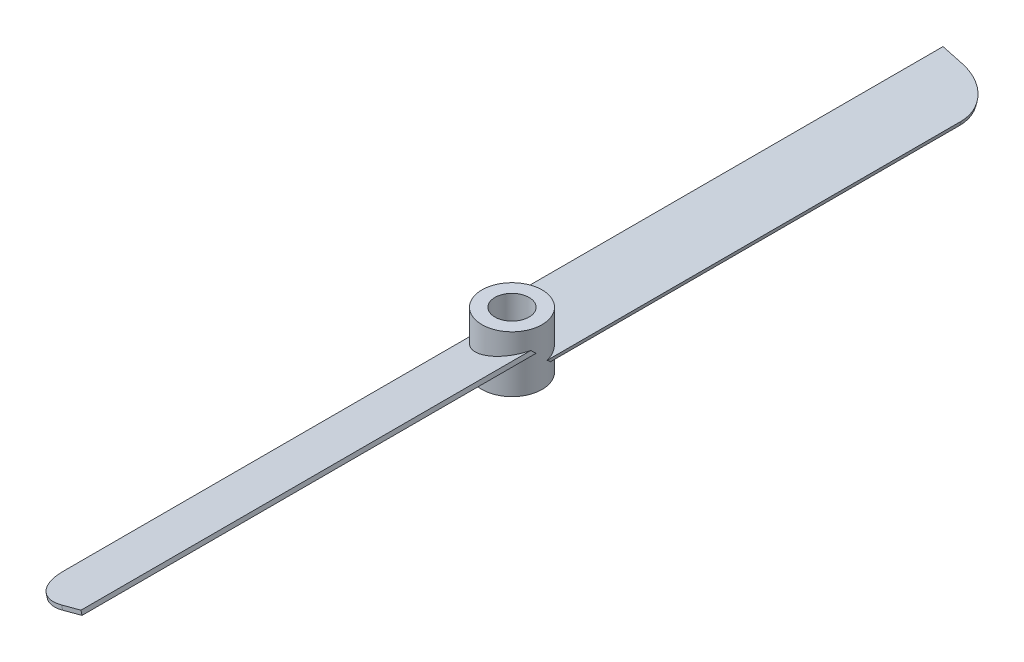
ISO-10303-21;
HEADER;
FILE_DESCRIPTION(('STEP AP214'),'2;1');
FILE_NAME('part.step','',(''),(''),'','','');
FILE_SCHEMA(('AUTOMOTIVE_DESIGN { 1 0 10303 214 1 1 1 1 }'));
ENDSEC;
DATA;
#1=APPLICATION_CONTEXT('core data for automotive mechanical design processes');
#2=APPLICATION_PROTOCOL_DEFINITION('international standard','automotive_design',2000,#1);
#3=PRODUCT_CONTEXT('',#1,'mechanical');
#4=PRODUCT('Part','Part','',(#3));
#5=PRODUCT_RELATED_PRODUCT_CATEGORY('part','',(#4));
#6=PRODUCT_DEFINITION_FORMATION('','',#4);
#7=PRODUCT_DEFINITION_CONTEXT('part definition',#1,'design');
#8=PRODUCT_DEFINITION('design','',#6,#7);
#9=PRODUCT_DEFINITION_SHAPE('','',#8);
#10=(LENGTH_UNIT() NAMED_UNIT(*) SI_UNIT(.MILLI.,.METRE.));
#11=(NAMED_UNIT(*) PLANE_ANGLE_UNIT() SI_UNIT($,.RADIAN.));
#12=(NAMED_UNIT(*) SI_UNIT($,.STERADIAN.) SOLID_ANGLE_UNIT());
#13=UNCERTAINTY_MEASURE_WITH_UNIT(LENGTH_MEASURE(1.E-05),#10,'distance_accuracy_value','');
#14=(GEOMETRIC_REPRESENTATION_CONTEXT(3) GLOBAL_UNCERTAINTY_ASSIGNED_CONTEXT((#13)) GLOBAL_UNIT_ASSIGNED_CONTEXT((#10,
#11,#12)) REPRESENTATION_CONTEXT('',''));
#15=CARTESIAN_POINT('',(0.,0.,0.));
#16=DIRECTION('',(0.,0.,1.));
#17=DIRECTION('',(1.,0.,0.));
#18=AXIS2_PLACEMENT_3D('',#15,#16,#17);
#19=CARTESIAN_POINT('',(0.,14.,0.));
#20=DIRECTION('',(0.,-1.,0.));
#21=DIRECTION('',(0.,0.,-1.));
#22=AXIS2_PLACEMENT_3D('',#19,#20,#21);
#23=CYLINDRICAL_SURFACE('',#22,7.5);
#24=CARTESIAN_POINT('',(0.,-21.9777747886716,0.));
#25=DIRECTION('',(-0.965925826289067,0.258819045102524,0.));
#26=DIRECTION('',(-0.258819045102524,-0.965925826289067,0.));
#27=AXIS2_PLACEMENT_3D('',#24,#25,#26);
#28=ELLIPSE('',#27,28.9777747886716,7.5);
#29=CARTESIAN_POINT('',(7.11046910095244,4.55885716173106,-2.38562972072383));
#30=VERTEX_POINT('',#29);
#31=CARTESIAN_POINT('',(7.37841829338357,5.55885716173106,-1.34496969774887));
#32=VERTEX_POINT('',#31);
#33=EDGE_CURVE('E124',#30,#32,#28,.F.);
#34=ORIENTED_EDGE('',*,*,#33,.T.);
#35=CARTESIAN_POINT('',(0.,7.53589838486225,0.));
#36=DIRECTION('',(0.258819045102525,0.965925826289067,0.));
#37=DIRECTION('',(0.965925826289067,-0.258819045102525,0.));
#38=AXIS2_PLACEMENT_3D('',#35,#36,#37);
#39=ELLIPSE('',#38,7.76457135307563,7.5);
#40=CARTESIAN_POINT('',(-7.11046910095244,9.44114283826893,-2.38562972072377));
#41=VERTEX_POINT('',#40);
#42=EDGE_CURVE('E116',#32,#41,#39,.T.);
#43=ORIENTED_EDGE('',*,*,#42,.T.);
#44=CARTESIAN_POINT('',(0.,35.9777747886716,0.));
#45=DIRECTION('',(-0.965925826289067,0.258819045102525,0.));
#46=DIRECTION('',(-0.258819045102525,-0.965925826289067,0.));
#47=AXIS2_PLACEMENT_3D('',#44,#45,#46);
#48=ELLIPSE('',#47,28.9777747886716,7.5);
#49=CARTESIAN_POINT('',(-7.37841829338358,8.44114283826894,-1.34496969774883));
#50=VERTEX_POINT('',#49);
#51=EDGE_CURVE('E121',#50,#41,#48,.F.);
#52=ORIENTED_EDGE('',*,*,#51,.F.);
#53=CARTESIAN_POINT('',(0.,6.46410161513775,0.));
#54=DIRECTION('',(0.258819045102525,0.965925826289067,0.));
#55=DIRECTION('',(0.965925826289067,-0.258819045102525,0.));
#56=AXIS2_PLACEMENT_3D('',#53,#54,#55);
#57=ELLIPSE('',#56,7.76457135307563,7.5);
#58=EDGE_CURVE('E127',#30,#50,#57,.T.);
#59=ORIENTED_EDGE('',*,*,#58,.F.);
#60=EDGE_LOOP('',(#34,#43,#52,#59));
#61=FACE_BOUND('',#60,.T.);
#62=CARTESIAN_POINT('',(0.,14.,0.));
#63=DIRECTION('',(0.,1.,0.));
#64=DIRECTION('',(0.,0.,1.));
#65=AXIS2_PLACEMENT_3D('',#62,#63,#64);
#66=CIRCLE('',#65,7.5);
#67=CARTESIAN_POINT('',(0.,14.,7.5));
#68=VERTEX_POINT('',#67);
#69=EDGE_CURVE('E203',#68,#68,#66,.T.);
#70=ORIENTED_EDGE('',*,*,#69,.F.);
#71=EDGE_LOOP('',(#70));
#72=FACE_BOUND('',#71,.T.);
#73=CARTESIAN_POINT('',(0.,0.,0.));
#74=DIRECTION('',(0.,1.,0.));
#75=DIRECTION('',(0.,0.,1.));
#76=AXIS2_PLACEMENT_3D('',#73,#74,#75);
#77=CIRCLE('',#76,7.5);
#78=CARTESIAN_POINT('',(0.,0.,7.5));
#79=VERTEX_POINT('',#78);
#80=EDGE_CURVE('E202',#79,#79,#77,.T.);
#81=ORIENTED_EDGE('',*,*,#80,.T.);
#82=EDGE_LOOP('',(#81));
#83=FACE_BOUND('',#82,.T.);
#84=CARTESIAN_POINT('',(0.,-21.9777747886716,0.));
#85=DIRECTION('',(0.965925826289067,0.258819045102524,0.));
#86=DIRECTION('',(0.258819045102525,-0.965925826289067,0.));
#87=AXIS2_PLACEMENT_3D('',#84,#85,#86);
#88=ELLIPSE('',#87,28.9777747886716,7.5);
#89=CARTESIAN_POINT('',(-7.11046910095244,4.55885716173106,2.38562972072383));
#90=VERTEX_POINT('',#89);
#91=CARTESIAN_POINT('',(-7.37841829338357,5.55885716173106,1.34496969774887));
#92=VERTEX_POINT('',#91);
#93=EDGE_CURVE('E166',#90,#92,#88,.F.);
#94=ORIENTED_EDGE('',*,*,#93,.T.);
#95=CARTESIAN_POINT('',(0.,7.53589838486225,0.));
#96=DIRECTION('',(-0.258819045102525,0.965925826289067,0.));
#97=DIRECTION('',(-0.965925826289067,-0.258819045102525,0.));
#98=AXIS2_PLACEMENT_3D('',#95,#96,#97);
#99=ELLIPSE('',#98,7.76457135307563,7.5);
#100=CARTESIAN_POINT('',(7.11046910095244,9.44114283826893,2.38562972072377));
#101=VERTEX_POINT('',#100);
#102=EDGE_CURVE('E213',#92,#101,#99,.T.);
#103=ORIENTED_EDGE('',*,*,#102,.T.);
#104=CARTESIAN_POINT('',(0.,35.9777747886716,0.));
#105=DIRECTION('',(0.965925826289067,0.258819045102525,0.));
#106=DIRECTION('',(0.258819045102525,-0.965925826289067,0.));
#107=AXIS2_PLACEMENT_3D('',#104,#105,#106);
#108=ELLIPSE('',#107,28.9777747886716,7.5);
#109=CARTESIAN_POINT('',(7.37841829338357,8.44114283826893,1.34496969774889));
#110=VERTEX_POINT('',#109);
#111=EDGE_CURVE('E157',#110,#101,#108,.F.);
#112=ORIENTED_EDGE('',*,*,#111,.F.);
#113=CARTESIAN_POINT('',(0.,6.46410161513775,0.));
#114=DIRECTION('',(-0.258819045102525,0.965925826289067,0.));
#115=DIRECTION('',(-0.965925826289067,-0.258819045102525,0.));
#116=AXIS2_PLACEMENT_3D('',#113,#114,#115);
#117=ELLIPSE('',#116,7.76457135307563,7.5);
#118=EDGE_CURVE('E207',#90,#110,#117,.T.);
#119=ORIENTED_EDGE('',*,*,#118,.F.);
#120=EDGE_LOOP('',(#94,#103,#112,#119));
#121=FACE_BOUND('',#120,.T.);
#122=ADVANCED_FACE('F39',(#61,#72,#83,#121),#23,.T.);
#123=CARTESIAN_POINT('',(0.,14.,0.));
#124=DIRECTION('',(0.,1.,0.));
#125=DIRECTION('',(0.,0.,1.));
#126=AXIS2_PLACEMENT_3D('',#123,#124,#125);
#127=PLANE('',#126);
#128=CARTESIAN_POINT('',(0.,14.,0.));
#129=DIRECTION('',(0.,1.,0.));
#130=DIRECTION('',(0.,0.,1.));
#131=AXIS2_PLACEMENT_3D('',#128,#129,#130);
#132=CIRCLE('',#131,4.25);
#133=CARTESIAN_POINT('',(0.,14.,4.25));
#134=VERTEX_POINT('',#133);
#135=EDGE_CURVE('E184',#134,#134,#132,.T.);
#136=ORIENTED_EDGE('',*,*,#135,.F.);
#137=EDGE_LOOP('',(#136));
#138=FACE_BOUND('',#137,.T.);
#139=ORIENTED_EDGE('',*,*,#69,.T.);
#140=EDGE_LOOP('',(#139));
#141=FACE_BOUND('',#140,.T.);
#142=ADVANCED_FACE('F254',(#138,#141),#127,.T.);
#143=CARTESIAN_POINT('',(0.,0.,0.));
#144=DIRECTION('',(0.,1.,0.));
#145=DIRECTION('',(0.,0.,1.));
#146=AXIS2_PLACEMENT_3D('',#143,#144,#145);
#147=PLANE('',#146);
#148=CARTESIAN_POINT('',(0.,0.,0.));
#149=DIRECTION('',(0.,1.,0.));
#150=DIRECTION('',(0.,0.,1.));
#151=AXIS2_PLACEMENT_3D('',#148,#149,#150);
#152=CIRCLE('',#151,4.25);
#153=CARTESIAN_POINT('',(0.,0.,4.25));
#154=VERTEX_POINT('',#153);
#155=EDGE_CURVE('E198',#154,#154,#152,.F.);
#156=ORIENTED_EDGE('',*,*,#155,.F.);
#157=EDGE_LOOP('',(#156));
#158=FACE_BOUND('',#157,.T.);
#159=ORIENTED_EDGE('',*,*,#80,.F.);
#160=EDGE_LOOP('',(#159));
#161=FACE_BOUND('',#160,.T.);
#162=ADVANCED_FACE('F259',(#158,#161),#147,.F.);
#163=CARTESIAN_POINT('',(0.,-0.000999999999999265,0.));
#164=DIRECTION('',(0.,1.,0.));
#165=DIRECTION('',(0.,0.,1.));
#166=AXIS2_PLACEMENT_3D('',#163,#164,#165);
#167=CYLINDRICAL_SURFACE('',#166,4.25);
#168=CARTESIAN_POINT('',(0.,14.,4.25));
#169=CARTESIAN_POINT('',(0.,13.8541666666667,4.25));
#170=CARTESIAN_POINT('',(0.,13.7083333333333,4.25));
#171=CARTESIAN_POINT('',(0.,13.4166666666667,4.25));
#172=CARTESIAN_POINT('',(0.,13.2708333333333,4.25));
#173=CARTESIAN_POINT('',(0.,12.9791666666667,4.25));
#174=CARTESIAN_POINT('',(0.,12.8333333333333,4.25));
#175=CARTESIAN_POINT('',(0.,12.5416666666667,4.25));
#176=CARTESIAN_POINT('',(0.,12.3958333333333,4.25));
#177=CARTESIAN_POINT('',(0.,12.1041666666667,4.25));
#178=CARTESIAN_POINT('',(0.,11.9583333333333,4.25));
#179=CARTESIAN_POINT('',(0.,11.6666666666667,4.25));
#180=CARTESIAN_POINT('',(0.,11.5208333333333,4.25));
#181=CARTESIAN_POINT('',(0.,11.2291666666667,4.25));
#182=CARTESIAN_POINT('',(0.,11.0833333333333,4.25));
#183=CARTESIAN_POINT('',(0.,10.7916666666667,4.25));
#184=CARTESIAN_POINT('',(0.,10.6458333333333,4.25));
#185=CARTESIAN_POINT('',(0.,10.3541666666667,4.25));
#186=CARTESIAN_POINT('',(0.,10.2083333333333,4.25));
#187=CARTESIAN_POINT('',(0.,9.91666666666667,4.25));
#188=CARTESIAN_POINT('',(0.,9.77083333333333,4.25));
#189=CARTESIAN_POINT('',(0.,9.47916666666667,4.25));
#190=CARTESIAN_POINT('',(0.,9.33333333333333,4.25));
#191=CARTESIAN_POINT('',(0.,9.04166666666666,4.25));
#192=CARTESIAN_POINT('',(0.,8.89583333333333,4.25));
#193=CARTESIAN_POINT('',(0.,8.60416666666666,4.25));
#194=CARTESIAN_POINT('',(0.,8.45833333333333,4.25));
#195=CARTESIAN_POINT('',(0.,8.16666666666667,4.25));
#196=CARTESIAN_POINT('',(0.,8.02083333333333,4.25));
#197=CARTESIAN_POINT('',(0.,7.72916666666667,4.25));
#198=CARTESIAN_POINT('',(0.,7.58333333333333,4.25));
#199=CARTESIAN_POINT('',(0.,7.29166666666667,4.25));
#200=CARTESIAN_POINT('',(0.,7.14583333333333,4.25));
#201=CARTESIAN_POINT('',(0.,6.85416666666667,4.25));
#202=CARTESIAN_POINT('',(0.,6.70833333333333,4.25));
#203=CARTESIAN_POINT('',(0.,6.41666666666667,4.25));
#204=CARTESIAN_POINT('',(0.,6.27083333333333,4.25));
#205=CARTESIAN_POINT('',(0.,5.97916666666667,4.25));
#206=CARTESIAN_POINT('',(0.,5.83333333333333,4.25));
#207=CARTESIAN_POINT('',(0.,5.54166666666667,4.25));
#208=CARTESIAN_POINT('',(0.,5.39583333333333,4.25));
#209=CARTESIAN_POINT('',(0.,5.10416666666667,4.25));
#210=CARTESIAN_POINT('',(0.,4.95833333333333,4.25));
#211=CARTESIAN_POINT('',(0.,4.66666666666667,4.25));
#212=CARTESIAN_POINT('',(0.,4.52083333333333,4.25));
#213=CARTESIAN_POINT('',(0.,4.22916666666667,4.25));
#214=CARTESIAN_POINT('',(0.,4.08333333333333,4.25));
#215=CARTESIAN_POINT('',(0.,3.79166666666667,4.25));
#216=CARTESIAN_POINT('',(0.,3.64583333333333,4.25));
#217=CARTESIAN_POINT('',(0.,3.35416666666667,4.25));
#218=CARTESIAN_POINT('',(0.,3.20833333333333,4.25));
#219=CARTESIAN_POINT('',(0.,2.91666666666667,4.25));
#220=CARTESIAN_POINT('',(0.,2.77083333333333,4.25));
#221=CARTESIAN_POINT('',(0.,2.47916666666667,4.25));
#222=CARTESIAN_POINT('',(0.,2.33333333333333,4.25));
#223=CARTESIAN_POINT('',(0.,2.04166666666667,4.25));
#224=CARTESIAN_POINT('',(0.,1.89583333333333,4.25));
#225=CARTESIAN_POINT('',(0.,1.60416666666667,4.25));
#226=CARTESIAN_POINT('',(0.,1.45833333333333,4.25));
#227=CARTESIAN_POINT('',(0.,1.16666666666667,4.25));
#228=CARTESIAN_POINT('',(0.,1.02083333333333,4.25));
#229=CARTESIAN_POINT('',(0.,0.729166666666667,4.25));
#230=CARTESIAN_POINT('',(0.,0.583333333333334,4.25));
#231=CARTESIAN_POINT('',(0.,0.291666666666667,4.25));
#232=CARTESIAN_POINT('',(0.,0.145833333333333,4.25));
#233=CARTESIAN_POINT('',(0.,0.,4.25));
#234=B_SPLINE_CURVE_WITH_KNOTS('',3,(#168,#169,#170,#171,#172,#173,#174,#175,#176,#177,#178,
#179,#180,#181,#182,#183,#184,#185,#186,#187,#188,#189,#190,#191,#192,#193,#194,#195,#196,#197,
#198,#199,#200,#201,#202,#203,#204,#205,#206,#207,#208,#209,#210,#211,#212,#213,#214,#215,#216,
#217,#218,#219,#220,#221,#222,#223,#224,#225,#226,#227,#228,#229,#230,#231,#232,#233),
.UNSPECIFIED.,.F.,.F.,(4,2,2,2,2,2,2,2,2,2,2,2,2,2,2,2,2,2,2,2,2,2,2,2,2,2,2,2,2,2,2,2,4),(0.,
0.4375,0.875000000000001,1.3125,1.75,2.1875,2.625,3.0625,3.5,3.9375,4.375,4.8125,5.25,5.6875,
6.125,6.5625,7.,7.4375,7.875,8.3125,8.75,9.1875,9.625,10.0625,10.5,10.9375,11.375,11.8125,12.25,
12.6875,13.125,13.5625,14.),.UNSPECIFIED.);
#235=EDGE_CURVE('BSEAM298',#134,#154,#234,.T.);
#236=ORIENTED_EDGE('',*,*,#135,.T.);
#237=ORIENTED_EDGE('',*,*,#155,.T.);
#238=ORIENTED_EDGE('',*,*,#235,.T.);
#239=ORIENTED_EDGE('',*,*,#235,.F.);
#240=EDGE_LOOP('',(#236,#238,#237,#239));
#241=FACE_BOUND('',#240,.T.);
#242=ADVANCED_FACE('F298',(#241),#167,.F.);
#243=CARTESIAN_POINT('',(-7.37841829338357,5.55885716173106,114.5));
#244=DIRECTION('',(-0.258819045102525,0.965925826289067,0.));
#245=DIRECTION('',(-0.965925826289067,-0.258819045102525,0.));
#246=AXIS2_PLACEMENT_3D('',#243,#244,#245);
#247=PLANE('',#246);
#248=DIRECTION('',(0.,0.,-1.));
#249=VECTOR('',#248,1.);
#250=CARTESIAN_POINT('',(-7.37841829338357,5.55885716173106,114.5));
#251=LINE('',#250,#249);
#252=CARTESIAN_POINT('',(-7.37841829338357,5.55885716173106,104.5));
#253=VERTEX_POINT('',#252);
#254=EDGE_CURVE('E181',#253,#92,#251,.T.);
#255=ORIENTED_EDGE('',*,*,#254,.F.);
#256=CARTESIAN_POINT('',(2.28083996950711,8.14704761275631,104.5));
#257=DIRECTION('',(-0.258819045102525,0.965925826289067,0.));
#258=DIRECTION('',(-0.965925826289067,-0.258819045102525,0.));
#259=AXIS2_PLACEMENT_3D('',#256,#257,#258);
#260=CIRCLE('',#259,10.);
#261=CARTESIAN_POINT('',(2.2808399695071,8.14704761275631,114.5));
#262=VERTEX_POINT('',#261);
#263=EDGE_CURVE('E220',#253,#262,#260,.T.);
#264=ORIENTED_EDGE('',*,*,#263,.T.);
#265=DIRECTION('',(0.965925826289067,0.258819045102525,0.));
#266=VECTOR('',#265,1.);
#267=CARTESIAN_POINT('',(-7.37841829338357,5.55885716173106,114.5));
#268=LINE('',#267,#266);
#269=CARTESIAN_POINT('',(7.11046910095244,9.44114283826893,114.5));
#270=VERTEX_POINT('',#269);
#271=EDGE_CURVE('E170',#262,#270,#268,.T.);
#272=ORIENTED_EDGE('',*,*,#271,.T.);
#273=DIRECTION('',(0.,0.,-1.));
#274=VECTOR('',#273,1.);
#275=CARTESIAN_POINT('',(7.11046910095244,9.44114283826893,114.5));
#276=LINE('',#275,#274);
#277=EDGE_CURVE('E180',#270,#101,#276,.T.);
#278=ORIENTED_EDGE('',*,*,#277,.T.);
#279=ORIENTED_EDGE('',*,*,#102,.F.);
#280=EDGE_LOOP('',(#255,#264,#272,#278,#279));
#281=FACE_BOUND('',#280,.T.);
#282=ADVANCED_FACE('F296',(#281),#247,.T.);
#283=CARTESIAN_POINT('',(-7.11046910095244,4.55885716173106,114.5));
#284=DIRECTION('',(-0.258819045102525,0.965925826289067,0.));
#285=DIRECTION('',(-0.965925826289067,-0.258819045102525,0.));
#286=AXIS2_PLACEMENT_3D('',#283,#284,#285);
#287=PLANE('',#286);
#288=DIRECTION('',(0.965925826289067,0.258819045102525,0.));
#289=VECTOR('',#288,1.);
#290=CARTESIAN_POINT('',(-7.11046910095244,4.55885716173106,114.5));
#291=LINE('',#290,#289);
#292=CARTESIAN_POINT('',(2.54878916193823,7.14704761275631,114.5));
#293=VERTEX_POINT('',#292);
#294=CARTESIAN_POINT('',(7.37841829338357,8.44114283826893,114.5));
#295=VERTEX_POINT('',#294);
#296=EDGE_CURVE('E177',#293,#295,#291,.T.);
#297=ORIENTED_EDGE('',*,*,#296,.F.);
#298=CARTESIAN_POINT('',(2.54878916193823,7.14704761275631,104.5));
#299=DIRECTION('',(-0.258819045102525,0.965925826289067,0.));
#300=DIRECTION('',(-0.965925826289067,-0.258819045102525,0.));
#301=AXIS2_PLACEMENT_3D('',#298,#299,#300);
#302=CIRCLE('',#301,10.);
#303=CARTESIAN_POINT('',(-7.11046910095244,4.55885716173106,104.5));
#304=VERTEX_POINT('',#303);
#305=EDGE_CURVE('E226',#293,#304,#302,.F.);
#306=ORIENTED_EDGE('',*,*,#305,.T.);
#307=DIRECTION('',(0.,0.,-1.));
#308=VECTOR('',#307,1.);
#309=CARTESIAN_POINT('',(-7.11046910095244,4.55885716173106,114.5));
#310=LINE('',#309,#308);
#311=EDGE_CURVE('E185',#304,#90,#310,.T.);
#312=ORIENTED_EDGE('',*,*,#311,.T.);
#313=ORIENTED_EDGE('',*,*,#118,.T.);
#314=DIRECTION('',(0.,0.,-1.));
#315=VECTOR('',#314,1.);
#316=CARTESIAN_POINT('',(7.37841829338357,8.44114283826893,114.5));
#317=LINE('',#316,#315);
#318=EDGE_CURVE('E188',#295,#110,#317,.T.);
#319=ORIENTED_EDGE('',*,*,#318,.F.);
#320=EDGE_LOOP('',(#297,#306,#312,#313,#319));
#321=FACE_BOUND('',#320,.T.);
#322=ADVANCED_FACE('F281',(#321),#287,.F.);
#323=CARTESIAN_POINT('',(-7.11046910095244,4.55885716173106,114.5));
#324=DIRECTION('',(-0.965925826289067,-0.258819045102524,0.));
#325=DIRECTION('',(0.258819045102524,-0.965925826289067,0.));
#326=AXIS2_PLACEMENT_3D('',#323,#324,#325);
#327=PLANE('',#326);
#328=ORIENTED_EDGE('',*,*,#311,.F.);
#329=DIRECTION('',(-0.258819045102524,0.965925826289067,0.));
#330=VECTOR('',#329,1.);
#331=CARTESIAN_POINT('',(-7.11046910095244,4.55885716173106,104.5));
#332=LINE('',#331,#330);
#333=EDGE_CURVE('E216',#304,#253,#332,.T.);
#334=ORIENTED_EDGE('',*,*,#333,.T.);
#335=ORIENTED_EDGE('',*,*,#254,.T.);
#336=ORIENTED_EDGE('',*,*,#93,.F.);
#337=EDGE_LOOP('',(#328,#334,#335,#336));
#338=FACE_BOUND('',#337,.T.);
#339=ADVANCED_FACE('F286',(#338),#327,.T.);
#340=CARTESIAN_POINT('',(7.37841829338357,8.44114283826893,114.5));
#341=DIRECTION('',(-0.965925826289067,-0.258819045102525,0.));
#342=DIRECTION('',(0.258819045102525,-0.965925826289067,0.));
#343=AXIS2_PLACEMENT_3D('',#340,#341,#342);
#344=PLANE('',#343);
#345=ORIENTED_EDGE('',*,*,#318,.T.);
#346=ORIENTED_EDGE('',*,*,#111,.T.);
#347=ORIENTED_EDGE('',*,*,#277,.F.);
#348=DIRECTION('',(-0.258819045102525,0.965925826289067,0.));
#349=VECTOR('',#348,1.);
#350=CARTESIAN_POINT('',(7.37841829338357,8.44114283826893,114.5));
#351=LINE('',#350,#349);
#352=EDGE_CURVE('E173',#295,#270,#351,.T.);
#353=ORIENTED_EDGE('',*,*,#352,.F.);
#354=EDGE_LOOP('',(#345,#346,#347,#353));
#355=FACE_BOUND('',#354,.T.);
#356=ADVANCED_FACE('F272',(#355),#344,.F.);
#357=CARTESIAN_POINT('',(0.,0.,114.5));
#358=DIRECTION('',(0.,0.,1.));
#359=DIRECTION('',(1.,0.,0.));
#360=AXIS2_PLACEMENT_3D('',#357,#358,#359);
#361=PLANE('',#360);
#362=ORIENTED_EDGE('',*,*,#271,.F.);
#363=DIRECTION('',(-0.258819045102524,0.965925826289067,0.));
#364=VECTOR('',#363,1.);
#365=CARTESIAN_POINT('',(4.16481456572269,1.11595869951079,114.5));
#366=LINE('',#365,#364);
#367=EDGE_CURVE('E223',#262,#293,#366,.F.);
#368=ORIENTED_EDGE('',*,*,#367,.T.);
#369=ORIENTED_EDGE('',*,*,#296,.T.);
#370=ORIENTED_EDGE('',*,*,#352,.T.);
#371=EDGE_LOOP('',(#362,#368,#369,#370));
#372=FACE_BOUND('',#371,.T.);
#373=ADVANCED_FACE('F265',(#372),#361,.T.);
#374=CARTESIAN_POINT('',(2.54878916193823,7.14704761275631,104.5));
#375=DIRECTION('',(-0.258819045102524,0.965925826289067,0.));
#376=DIRECTION('',(-0.965925826289067,-0.258819045102524,0.));
#377=AXIS2_PLACEMENT_3D('',#374,#375,#376);
#378=CYLINDRICAL_SURFACE('',#377,10.);
#379=ORIENTED_EDGE('',*,*,#305,.F.);
#380=ORIENTED_EDGE('',*,*,#367,.F.);
#381=ORIENTED_EDGE('',*,*,#263,.F.);
#382=ORIENTED_EDGE('',*,*,#333,.F.);
#383=EDGE_LOOP('',(#379,#380,#381,#382));
#384=FACE_BOUND('',#383,.T.);
#385=ADVANCED_FACE('F263',(#384),#378,.T.);
#386=CARTESIAN_POINT('',(7.37841829338357,5.55885716173106,-114.5));
#387=DIRECTION('',(0.258819045102525,0.965925826289067,0.));
#388=DIRECTION('',(-0.965925826289067,0.258819045102525,0.));
#389=AXIS2_PLACEMENT_3D('',#386,#387,#388);
#390=PLANE('',#389);
#391=DIRECTION('',(0.,0.,1.));
#392=VECTOR('',#391,1.);
#393=CARTESIAN_POINT('',(7.37841829338357,5.55885716173106,-114.5));
#394=LINE('',#393,#392);
#395=CARTESIAN_POINT('',(7.37841829338357,5.55885716173106,-104.5));
#396=VERTEX_POINT('',#395);
#397=EDGE_CURVE('E154',#396,#32,#394,.T.);
#398=ORIENTED_EDGE('',*,*,#397,.F.);
#399=CARTESIAN_POINT('',(-2.28083996950711,8.14704761275631,-104.5));
#400=DIRECTION('',(0.258819045102525,0.965925826289067,0.));
#401=DIRECTION('',(-0.965925826289067,0.258819045102525,0.));
#402=AXIS2_PLACEMENT_3D('',#399,#400,#401);
#403=CIRCLE('',#402,10.);
#404=CARTESIAN_POINT('',(-2.2808399695071,8.14704761275631,-114.5));
#405=VERTEX_POINT('',#404);
#406=EDGE_CURVE('E62',#396,#405,#403,.T.);
#407=ORIENTED_EDGE('',*,*,#406,.T.);
#408=DIRECTION('',(-0.965925826289067,0.258819045102525,0.));
#409=VECTOR('',#408,1.);
#410=CARTESIAN_POINT('',(7.37841829338357,5.55885716173106,-114.5));
#411=LINE('',#410,#409);
#412=CARTESIAN_POINT('',(-7.11046910095244,9.44114283826893,-114.5));
#413=VERTEX_POINT('',#412);
#414=EDGE_CURVE('E132',#405,#413,#411,.T.);
#415=ORIENTED_EDGE('',*,*,#414,.T.);
#416=DIRECTION('',(0.,0.,1.));
#417=VECTOR('',#416,1.);
#418=CARTESIAN_POINT('',(-7.11046910095244,9.44114283826893,-114.5));
#419=LINE('',#418,#417);
#420=EDGE_CURVE('E130',#413,#41,#419,.T.);
#421=ORIENTED_EDGE('',*,*,#420,.T.);
#422=ORIENTED_EDGE('',*,*,#42,.F.);
#423=EDGE_LOOP('',(#398,#407,#415,#421,#422));
#424=FACE_BOUND('',#423,.T.);
#425=ADVANCED_FACE('F131',(#424),#390,.T.);
#426=CARTESIAN_POINT('',(7.11046910095244,4.55885716173106,-114.5));
#427=DIRECTION('',(0.258819045102525,0.965925826289067,0.));
#428=DIRECTION('',(-0.965925826289067,0.258819045102525,0.));
#429=AXIS2_PLACEMENT_3D('',#426,#427,#428);
#430=PLANE('',#429);
#431=DIRECTION('',(-0.965925826289067,0.258819045102525,0.));
#432=VECTOR('',#431,1.);
#433=CARTESIAN_POINT('',(7.11046910095244,4.55885716173106,-114.5));
#434=LINE('',#433,#432);
#435=CARTESIAN_POINT('',(-2.54878916193823,7.14704761275631,-114.5));
#436=VERTEX_POINT('',#435);
#437=CARTESIAN_POINT('',(-7.37841829338357,8.44114283826893,-114.5));
#438=VERTEX_POINT('',#437);
#439=EDGE_CURVE('E138',#436,#438,#434,.T.);
#440=ORIENTED_EDGE('',*,*,#439,.F.);
#441=CARTESIAN_POINT('',(-2.54878916193823,7.14704761275631,-104.5));
#442=DIRECTION('',(0.258819045102525,0.965925826289067,0.));
#443=DIRECTION('',(-0.965925826289067,0.258819045102525,0.));
#444=AXIS2_PLACEMENT_3D('',#441,#442,#443);
#445=CIRCLE('',#444,10.);
#446=CARTESIAN_POINT('',(7.11046910095244,4.55885716173106,-104.5));
#447=VERTEX_POINT('',#446);
#448=EDGE_CURVE('E11',#436,#447,#445,.F.);
#449=ORIENTED_EDGE('',*,*,#448,.T.);
#450=DIRECTION('',(0.,0.,1.));
#451=VECTOR('',#450,1.);
#452=CARTESIAN_POINT('',(7.11046910095244,4.55885716173106,-114.5));
#453=LINE('',#452,#451);
#454=EDGE_CURVE('E158',#447,#30,#453,.T.);
#455=ORIENTED_EDGE('',*,*,#454,.T.);
#456=ORIENTED_EDGE('',*,*,#58,.T.);
#457=DIRECTION('',(0.,0.,1.));
#458=VECTOR('',#457,1.);
#459=CARTESIAN_POINT('',(-7.37841829338357,8.44114283826893,-114.5));
#460=LINE('',#459,#458);
#461=EDGE_CURVE('E137',#438,#50,#460,.T.);
#462=ORIENTED_EDGE('',*,*,#461,.F.);
#463=EDGE_LOOP('',(#440,#449,#455,#456,#462));
#464=FACE_BOUND('',#463,.T.);
#465=ADVANCED_FACE('F243',(#464),#430,.F.);
#466=CARTESIAN_POINT('',(7.11046910095244,4.55885716173106,-114.5));
#467=DIRECTION('',(0.965925826289067,-0.258819045102524,0.));
#468=DIRECTION('',(0.258819045102524,0.965925826289067,0.));
#469=AXIS2_PLACEMENT_3D('',#466,#467,#468);
#470=PLANE('',#469);
#471=ORIENTED_EDGE('',*,*,#454,.F.);
#472=DIRECTION('',(0.258819045102524,0.965925826289067,0.));
#473=VECTOR('',#472,1.);
#474=CARTESIAN_POINT('',(7.11046910095244,4.55885716173106,-104.5));
#475=LINE('',#474,#473);
#476=EDGE_CURVE('E126',#447,#396,#475,.T.);
#477=ORIENTED_EDGE('',*,*,#476,.T.);
#478=ORIENTED_EDGE('',*,*,#397,.T.);
#479=ORIENTED_EDGE('',*,*,#33,.F.);
#480=EDGE_LOOP('',(#471,#477,#478,#479));
#481=FACE_BOUND('',#480,.T.);
#482=ADVANCED_FACE('F239',(#481),#470,.T.);
#483=CARTESIAN_POINT('',(-7.37841829338357,8.44114283826893,-114.5));
#484=DIRECTION('',(0.965925826289067,-0.258819045102525,0.));
#485=DIRECTION('',(0.258819045102525,0.965925826289067,0.));
#486=AXIS2_PLACEMENT_3D('',#483,#484,#485);
#487=PLANE('',#486);
#488=ORIENTED_EDGE('',*,*,#461,.T.);
#489=ORIENTED_EDGE('',*,*,#51,.T.);
#490=ORIENTED_EDGE('',*,*,#420,.F.);
#491=DIRECTION('',(0.258819045102525,0.965925826289067,0.));
#492=VECTOR('',#491,1.);
#493=CARTESIAN_POINT('',(-7.37841829338357,8.44114283826893,-114.5));
#494=LINE('',#493,#492);
#495=EDGE_CURVE('E149',#438,#413,#494,.T.);
#496=ORIENTED_EDGE('',*,*,#495,.F.);
#497=EDGE_LOOP('',(#488,#489,#490,#496));
#498=FACE_BOUND('',#497,.T.);
#499=ADVANCED_FACE('F140',(#498),#487,.F.);
#500=CARTESIAN_POINT('',(0.,0.,-114.5));
#501=DIRECTION('',(0.,0.,-1.));
#502=DIRECTION('',(-1.,0.,0.));
#503=AXIS2_PLACEMENT_3D('',#500,#501,#502);
#504=PLANE('',#503);
#505=ORIENTED_EDGE('',*,*,#414,.F.);
#506=DIRECTION('',(0.258819045102524,0.965925826289067,0.));
#507=VECTOR('',#506,1.);
#508=CARTESIAN_POINT('',(-4.16481456572269,1.11595869951079,-114.5));
#509=LINE('',#508,#507);
#510=EDGE_CURVE('E48',#405,#436,#509,.F.);
#511=ORIENTED_EDGE('',*,*,#510,.T.);
#512=ORIENTED_EDGE('',*,*,#439,.T.);
#513=ORIENTED_EDGE('',*,*,#495,.T.);
#514=EDGE_LOOP('',(#505,#511,#512,#513));
#515=FACE_BOUND('',#514,.T.);
#516=ADVANCED_FACE('F244',(#515),#504,.T.);
#517=CARTESIAN_POINT('',(-2.54878916193823,7.14704761275631,-104.5));
#518=DIRECTION('',(0.258819045102524,0.965925826289067,0.));
#519=DIRECTION('',(-0.965925826289067,0.258819045102524,0.));
#520=AXIS2_PLACEMENT_3D('',#517,#518,#519);
#521=CYLINDRICAL_SURFACE('',#520,10.);
#522=ORIENTED_EDGE('',*,*,#448,.F.);
#523=ORIENTED_EDGE('',*,*,#510,.F.);
#524=ORIENTED_EDGE('',*,*,#406,.F.);
#525=ORIENTED_EDGE('',*,*,#476,.F.);
#526=EDGE_LOOP('',(#522,#523,#524,#525));
#527=FACE_BOUND('',#526,.T.);
#528=ADVANCED_FACE('F41',(#527),#521,.T.);
#529=CLOSED_SHELL('',(#122,#142,#162,#242,#282,#322,#339,#356,#373,#385,#425,#465,#482,#499,
#516,#528));
#530=MANIFOLD_SOLID_BREP('B2',#529);
#531=ADVANCED_BREP_SHAPE_REPRESENTATION('',(#18,#530),#14);
#532=SHAPE_DEFINITION_REPRESENTATION(#9,#531);
ENDSEC;
END-ISO-10303-21;
